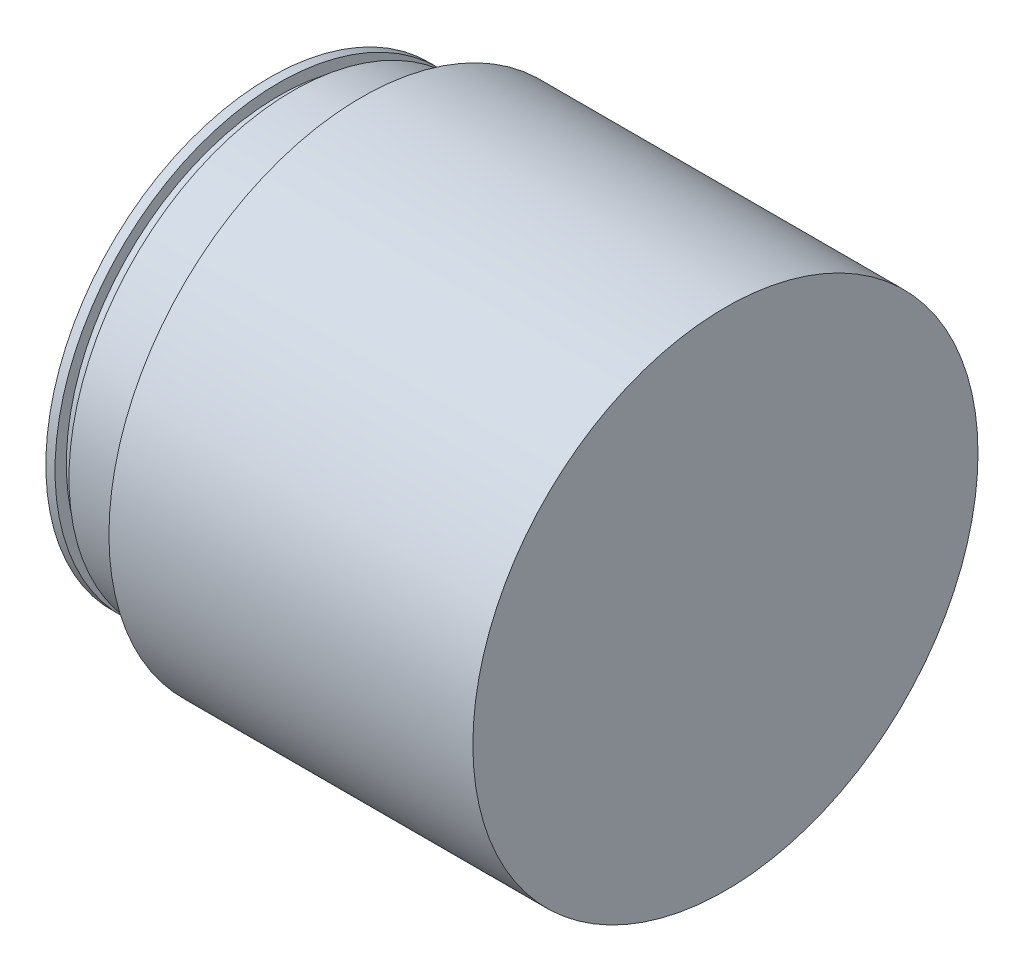
ISO-10303-21;
HEADER;
FILE_DESCRIPTION(('STEP AP214'),'2;1');
FILE_NAME('part.step','',(''),(''),'','','');
FILE_SCHEMA(('AUTOMOTIVE_DESIGN { 1 0 10303 214 1 1 1 1 }'));
ENDSEC;
DATA;
#1=APPLICATION_CONTEXT('core data for automotive mechanical design processes');
#2=APPLICATION_PROTOCOL_DEFINITION('international standard','automotive_design',2000,#1);
#3=PRODUCT_CONTEXT('',#1,'mechanical');
#4=PRODUCT('Part','Part','',(#3));
#5=PRODUCT_RELATED_PRODUCT_CATEGORY('part','',(#4));
#6=PRODUCT_DEFINITION_FORMATION('','',#4);
#7=PRODUCT_DEFINITION_CONTEXT('part definition',#1,'design');
#8=PRODUCT_DEFINITION('design','',#6,#7);
#9=PRODUCT_DEFINITION_SHAPE('','',#8);
#10=(LENGTH_UNIT() NAMED_UNIT(*) SI_UNIT(.MILLI.,.METRE.));
#11=(NAMED_UNIT(*) PLANE_ANGLE_UNIT() SI_UNIT($,.RADIAN.));
#12=(NAMED_UNIT(*) SI_UNIT($,.STERADIAN.) SOLID_ANGLE_UNIT());
#13=UNCERTAINTY_MEASURE_WITH_UNIT(LENGTH_MEASURE(1.E-05),#10,'distance_accuracy_value','');
#14=(GEOMETRIC_REPRESENTATION_CONTEXT(3) GLOBAL_UNCERTAINTY_ASSIGNED_CONTEXT((#13)) GLOBAL_UNIT_ASSIGNED_CONTEXT((#10,
#11,#12)) REPRESENTATION_CONTEXT('',''));
#15=CARTESIAN_POINT('',(0.,0.,0.));
#16=DIRECTION('',(0.,0.,1.));
#17=DIRECTION('',(1.,0.,0.));
#18=AXIS2_PLACEMENT_3D('',#15,#16,#17);
#19=CARTESIAN_POINT('',(85.471,-30.9499,0.));
#20=DIRECTION('',(-1.,0.,0.));
#21=DIRECTION('',(0.,0.,1.));
#22=AXIS2_PLACEMENT_3D('',#19,#20,#21);
#23=CYLINDRICAL_SURFACE('',#22,34.925);
#24=CARTESIAN_POINT('',(12.7,-30.9499,0.));
#25=DIRECTION('',(1.,0.,0.));
#26=DIRECTION('',(0.,0.,-1.));
#27=AXIS2_PLACEMENT_3D('',#24,#25,#26);
#28=CIRCLE('',#27,34.925);
#29=CARTESIAN_POINT('',(12.7,-30.9499,-34.925));
#30=VERTEX_POINT('',#29);
#31=EDGE_CURVE('E73',#30,#30,#28,.T.);
#32=ORIENTED_EDGE('',*,*,#31,.T.);
#33=EDGE_LOOP('',(#32));
#34=FACE_BOUND('',#33,.T.);
#35=CARTESIAN_POINT('',(63.02502,-30.9499,0.));
#36=DIRECTION('',(1.,0.,0.));
#37=DIRECTION('',(0.,0.,-1.));
#38=AXIS2_PLACEMENT_3D('',#35,#36,#37);
#39=CIRCLE('',#38,34.925);
#40=CARTESIAN_POINT('',(63.02502,-30.9499,-34.925));
#41=VERTEX_POINT('',#40);
#42=EDGE_CURVE('E70',#41,#41,#39,.F.);
#43=ORIENTED_EDGE('',*,*,#42,.T.);
#44=EDGE_LOOP('',(#43));
#45=FACE_BOUND('',#44,.T.);
#46=ADVANCED_FACE('F53',(#34,#45),#23,.T.);
#47=CARTESIAN_POINT('',(11.9645218927644,-30.9499,0.));
#48=DIRECTION('',(1.,0.,0.));
#49=DIRECTION('',(0.,0.,-1.));
#50=AXIS2_PLACEMENT_3D('',#47,#48,#49);
#51=CYLINDRICAL_SURFACE('',#50,30.9499);
#52=CARTESIAN_POINT('',(0.,-30.9499,0.));
#53=DIRECTION('',(1.,0.,0.));
#54=DIRECTION('',(0.,0.,-1.));
#55=AXIS2_PLACEMENT_3D('',#52,#53,#54);
#56=CIRCLE('',#55,30.9499);
#57=CARTESIAN_POINT('',(0.,-30.9499,-30.9499));
#58=VERTEX_POINT('',#57);
#59=EDGE_CURVE('E76',#58,#58,#56,.T.);
#60=ORIENTED_EDGE('',*,*,#59,.T.);
#61=EDGE_LOOP('',(#60));
#62=FACE_BOUND('',#61,.T.);
#63=CARTESIAN_POINT('',(1.27,-30.9499,0.));
#64=DIRECTION('',(1.,0.,0.));
#65=DIRECTION('',(0.,0.,-1.));
#66=AXIS2_PLACEMENT_3D('',#63,#64,#65);
#67=CIRCLE('',#66,30.9499);
#68=CARTESIAN_POINT('',(1.27,-30.9499,-30.9499));
#69=VERTEX_POINT('',#68);
#70=EDGE_CURVE('E57',#69,#69,#67,.T.);
#71=ORIENTED_EDGE('',*,*,#70,.F.);
#72=EDGE_LOOP('',(#71));
#73=FACE_BOUND('',#72,.T.);
#74=ADVANCED_FACE('F55',(#62,#73),#51,.T.);
#75=CARTESIAN_POINT('',(1.27,0.,0.));
#76=DIRECTION('',(1.,0.,0.));
#77=DIRECTION('',(0.,0.,-1.));
#78=AXIS2_PLACEMENT_3D('',#75,#76,#77);
#79=PLANE('',#78);
#80=ORIENTED_EDGE('',*,*,#70,.T.);
#81=EDGE_LOOP('',(#80));
#82=FACE_BOUND('',#81,.T.);
#83=CARTESIAN_POINT('',(1.27,-30.9499,0.));
#84=DIRECTION('',(1.,0.,0.));
#85=DIRECTION('',(0.,0.,-1.));
#86=AXIS2_PLACEMENT_3D('',#83,#84,#85);
#87=CIRCLE('',#86,29.3878);
#88=CARTESIAN_POINT('',(1.27,-30.9499,-29.3878));
#89=VERTEX_POINT('',#88);
#90=EDGE_CURVE('E65',#89,#89,#87,.T.);
#91=ORIENTED_EDGE('',*,*,#90,.F.);
#92=EDGE_LOOP('',(#91));
#93=FACE_BOUND('',#92,.T.);
#94=ADVANCED_FACE('F93',(#82,#93),#79,.T.);
#95=CARTESIAN_POINT('',(11.9645218927644,-30.9499,0.));
#96=DIRECTION('',(1.,0.,0.));
#97=DIRECTION('',(0.,0.,-1.));
#98=AXIS2_PLACEMENT_3D('',#95,#96,#97);
#99=CYLINDRICAL_SURFACE('',#98,29.3878);
#100=ORIENTED_EDGE('',*,*,#90,.T.);
#101=EDGE_LOOP('',(#100));
#102=FACE_BOUND('',#101,.T.);
#103=CARTESIAN_POINT('',(3.2004,-30.9499,0.));
#104=DIRECTION('',(1.,0.,0.));
#105=DIRECTION('',(0.,0.,-1.));
#106=AXIS2_PLACEMENT_3D('',#103,#104,#105);
#107=CIRCLE('',#106,29.3878);
#108=CARTESIAN_POINT('',(3.2004,-30.9499,-29.3878));
#109=VERTEX_POINT('',#108);
#110=EDGE_CURVE('E85',#109,#109,#107,.T.);
#111=ORIENTED_EDGE('',*,*,#110,.F.);
#112=EDGE_LOOP('',(#111));
#113=FACE_BOUND('',#112,.T.);
#114=ADVANCED_FACE('F90',(#102,#113),#99,.T.);
#115=CARTESIAN_POINT('',(3.2004,0.,0.));
#116=DIRECTION('',(-1.,0.,0.));
#117=DIRECTION('',(0.,0.,1.));
#118=AXIS2_PLACEMENT_3D('',#115,#116,#117);
#119=PLANE('',#118);
#120=ORIENTED_EDGE('',*,*,#110,.T.);
#121=EDGE_LOOP('',(#120));
#122=FACE_BOUND('',#121,.T.);
#123=CARTESIAN_POINT('',(3.2004,-30.9499,0.));
#124=DIRECTION('',(1.,0.,0.));
#125=DIRECTION('',(0.,0.,-1.));
#126=AXIS2_PLACEMENT_3D('',#123,#124,#125);
#127=CIRCLE('',#126,30.9499);
#128=CARTESIAN_POINT('',(3.2004,-30.9499,-30.9499));
#129=VERTEX_POINT('',#128);
#130=EDGE_CURVE('E82',#129,#129,#127,.T.);
#131=ORIENTED_EDGE('',*,*,#130,.F.);
#132=EDGE_LOOP('',(#131));
#133=FACE_BOUND('',#132,.T.);
#134=ADVANCED_FACE('F100',(#122,#133),#119,.T.);
#135=CARTESIAN_POINT('',(11.9645218927644,-30.9499,0.));
#136=DIRECTION('',(1.,0.,0.));
#137=DIRECTION('',(0.,0.,-1.));
#138=AXIS2_PLACEMENT_3D('',#135,#136,#137);
#139=CYLINDRICAL_SURFACE('',#138,30.9499);
#140=ORIENTED_EDGE('',*,*,#130,.T.);
#141=EDGE_LOOP('',(#140));
#142=FACE_BOUND('',#141,.T.);
#143=CARTESIAN_POINT('',(12.7,-30.9499,0.));
#144=DIRECTION('',(1.,0.,0.));
#145=DIRECTION('',(0.,0.,-1.));
#146=AXIS2_PLACEMENT_3D('',#143,#144,#145);
#147=CIRCLE('',#146,30.9499);
#148=CARTESIAN_POINT('',(12.7,-30.9499,-30.9499));
#149=VERTEX_POINT('',#148);
#150=EDGE_CURVE('E79',#149,#149,#147,.T.);
#151=ORIENTED_EDGE('',*,*,#150,.F.);
#152=EDGE_LOOP('',(#151));
#153=FACE_BOUND('',#152,.T.);
#154=ADVANCED_FACE('F117',(#142,#153),#139,.T.);
#155=CARTESIAN_POINT('',(0.,0.,0.));
#156=DIRECTION('',(-1.,0.,0.));
#157=DIRECTION('',(0.,0.,1.));
#158=AXIS2_PLACEMENT_3D('',#155,#156,#157);
#159=PLANE('',#158);
#160=CARTESIAN_POINT('',(0.,-30.9499,0.));
#161=DIRECTION('',(-1.,0.,0.));
#162=DIRECTION('',(0.,-1.,0.));
#163=AXIS2_PLACEMENT_3D('',#160,#161,#162);
#164=CIRCLE('',#163,22.86);
#165=CARTESIAN_POINT('',(0.,-53.8099,0.));
#166=VERTEX_POINT('',#165);
#167=EDGE_CURVE('E13',#166,#166,#164,.T.);
#168=ORIENTED_EDGE('',*,*,#167,.F.);
#169=EDGE_LOOP('',(#168));
#170=FACE_BOUND('',#169,.T.);
#171=ORIENTED_EDGE('',*,*,#59,.F.);
#172=EDGE_LOOP('',(#171));
#173=FACE_BOUND('',#172,.T.);
#174=ADVANCED_FACE('F115',(#170,#173),#159,.T.);
#175=CARTESIAN_POINT('',(12.7,-30.9499,0.));
#176=DIRECTION('',(1.,0.,0.));
#177=DIRECTION('',(0.,0.,-1.));
#178=AXIS2_PLACEMENT_3D('',#175,#176,#177);
#179=PLANE('',#178);
#180=ORIENTED_EDGE('',*,*,#150,.T.);
#181=EDGE_LOOP('',(#180));
#182=FACE_BOUND('',#181,.T.);
#183=ORIENTED_EDGE('',*,*,#31,.F.);
#184=EDGE_LOOP('',(#183));
#185=FACE_BOUND('',#184,.T.);
#186=ADVANCED_FACE('F113',(#182,#185),#179,.F.);
#187=CARTESIAN_POINT('',(63.02502,-36.0299000867761,-8.79881805234969));
#188=DIRECTION('',(1.,0.,0.));
#189=DIRECTION('',(0.,0.,-1.));
#190=AXIS2_PLACEMENT_3D('',#187,#188,#189);
#191=PLANE('',#190);
#192=ORIENTED_EDGE('',*,*,#42,.F.);
#193=EDGE_LOOP('',(#192));
#194=FACE_BOUND('',#193,.T.);
#195=ADVANCED_FACE('F133',(#194),#191,.T.);
#196=CARTESIAN_POINT('',(-1.01599999999999,-30.9499,0.));
#197=DIRECTION('',(1.,0.,0.));
#198=DIRECTION('',(0.,1.,0.));
#199=AXIS2_PLACEMENT_3D('',#196,#197,#198);
#200=CYLINDRICAL_SURFACE('',#199,22.86);
#201=CARTESIAN_POINT('',(-1.01599999999999,-30.9499,0.));
#202=DIRECTION('',(-1.,0.,0.));
#203=DIRECTION('',(0.,-1.,0.));
#204=AXIS2_PLACEMENT_3D('',#201,#202,#203);
#205=CIRCLE('',#204,22.86);
#206=CARTESIAN_POINT('',(-1.01599999999998,-53.8099,0.));
#207=VERTEX_POINT('',#206);
#208=EDGE_CURVE('E68',#207,#207,#205,.T.);
#209=ORIENTED_EDGE('',*,*,#208,.F.);
#210=EDGE_LOOP('',(#209));
#211=FACE_BOUND('',#210,.T.);
#212=ORIENTED_EDGE('',*,*,#167,.T.);
#213=EDGE_LOOP('',(#212));
#214=FACE_BOUND('',#213,.T.);
#215=ADVANCED_FACE('F138',(#211,#214),#200,.T.);
#216=CARTESIAN_POINT('',(-1.01599999999999,-30.9499,0.));
#217=DIRECTION('',(-1.,0.,0.));
#218=DIRECTION('',(0.,-1.,0.));
#219=AXIS2_PLACEMENT_3D('',#216,#217,#218);
#220=PLANE('',#219);
#221=CARTESIAN_POINT('',(-1.01599999999999,-30.9499,0.));
#222=DIRECTION('',(-1.,0.,0.));
#223=DIRECTION('',(0.,-1.,0.));
#224=AXIS2_PLACEMENT_3D('',#221,#222,#223);
#225=CIRCLE('',#224,4.1021);
#226=CARTESIAN_POINT('',(-1.01599999999999,-30.9499,-4.1021));
#227=VERTEX_POINT('',#226);
#228=EDGE_CURVE('E206',#227,#227,#225,.F.);
#229=ORIENTED_EDGE('',*,*,#228,.T.);
#230=EDGE_LOOP('',(#229));
#231=FACE_BOUND('',#230,.T.);
#232=CARTESIAN_POINT('',(-1.01599999999998,-30.9499,-9.525));
#233=DIRECTION('',(1.,0.,0.));
#234=DIRECTION('',(0.,0.,-1.));
#235=AXIS2_PLACEMENT_3D('',#232,#233,#234);
#236=CIRCLE('',#235,3.175);
#237=CARTESIAN_POINT('',(-1.01599999999998,-30.9499,-12.7));
#238=VERTEX_POINT('',#237);
#239=EDGE_CURVE('E209',#238,#238,#236,.T.);
#240=ORIENTED_EDGE('',*,*,#239,.T.);
#241=EDGE_LOOP('',(#240));
#242=FACE_BOUND('',#241,.T.);
#243=CARTESIAN_POINT('',(-1.01599999999998,-40.4749,0.));
#244=DIRECTION('',(1.,0.,0.));
#245=DIRECTION('',(0.,0.,-1.));
#246=AXIS2_PLACEMENT_3D('',#243,#244,#245);
#247=CIRCLE('',#246,3.175);
#248=CARTESIAN_POINT('',(-1.01599999999998,-40.4749,-3.175));
#249=VERTEX_POINT('',#248);
#250=EDGE_CURVE('E212',#249,#249,#247,.T.);
#251=ORIENTED_EDGE('',*,*,#250,.T.);
#252=EDGE_LOOP('',(#251));
#253=FACE_BOUND('',#252,.T.);
#254=CARTESIAN_POINT('',(-1.01599999999998,-30.9499,9.525));
#255=DIRECTION('',(1.,0.,0.));
#256=DIRECTION('',(0.,0.,-1.));
#257=AXIS2_PLACEMENT_3D('',#254,#255,#256);
#258=CIRCLE('',#257,3.175);
#259=CARTESIAN_POINT('',(-1.01599999999998,-30.9499,6.35));
#260=VERTEX_POINT('',#259);
#261=EDGE_CURVE('E215',#260,#260,#258,.T.);
#262=ORIENTED_EDGE('',*,*,#261,.T.);
#263=EDGE_LOOP('',(#262));
#264=FACE_BOUND('',#263,.T.);
#265=CARTESIAN_POINT('',(-1.01599999999998,-21.4249,0.));
#266=DIRECTION('',(1.,0.,0.));
#267=DIRECTION('',(0.,0.,-1.));
#268=AXIS2_PLACEMENT_3D('',#265,#266,#267);
#269=CIRCLE('',#268,3.175);
#270=CARTESIAN_POINT('',(-1.01599999999998,-21.4249,-3.175));
#271=VERTEX_POINT('',#270);
#272=EDGE_CURVE('E217',#271,#271,#269,.T.);
#273=ORIENTED_EDGE('',*,*,#272,.T.);
#274=EDGE_LOOP('',(#273));
#275=FACE_BOUND('',#274,.T.);
#276=ORIENTED_EDGE('',*,*,#208,.T.);
#277=EDGE_LOOP('',(#276));
#278=FACE_BOUND('',#277,.T.);
#279=ADVANCED_FACE('F143',(#231,#242,#253,#264,#275,#278),#220,.T.);
#280=CARTESIAN_POINT('',(12.7,-21.4249,0.));
#281=DIRECTION('',(1.,0.,0.));
#282=DIRECTION('',(0.,0.,-1.));
#283=AXIS2_PLACEMENT_3D('',#280,#281,#282);
#284=CYLINDRICAL_SURFACE('',#283,3.175);
#285=ORIENTED_EDGE('',*,*,#272,.F.);
#286=EDGE_LOOP('',(#285));
#287=FACE_BOUND('',#286,.T.);
#288=CARTESIAN_POINT('',(12.7,-21.4249,0.));
#289=DIRECTION('',(1.,0.,0.));
#290=DIRECTION('',(0.,0.,-1.));
#291=AXIS2_PLACEMENT_3D('',#288,#289,#290);
#292=CIRCLE('',#291,3.175);
#293=CARTESIAN_POINT('',(12.7,-21.4249,-3.175));
#294=VERTEX_POINT('',#293);
#295=EDGE_CURVE('E204',#294,#294,#292,.F.);
#296=ORIENTED_EDGE('',*,*,#295,.F.);
#297=EDGE_LOOP('',(#296));
#298=FACE_BOUND('',#297,.T.);
#299=ADVANCED_FACE('F150',(#287,#298),#284,.F.);
#300=CARTESIAN_POINT('',(12.7,-30.9499,9.525));
#301=DIRECTION('',(1.,0.,0.));
#302=DIRECTION('',(0.,0.,-1.));
#303=AXIS2_PLACEMENT_3D('',#300,#301,#302);
#304=CYLINDRICAL_SURFACE('',#303,3.175);
#305=ORIENTED_EDGE('',*,*,#261,.F.);
#306=EDGE_LOOP('',(#305));
#307=FACE_BOUND('',#306,.T.);
#308=CARTESIAN_POINT('',(12.7,-30.9499,9.525));
#309=DIRECTION('',(1.,0.,0.));
#310=DIRECTION('',(0.,0.,-1.));
#311=AXIS2_PLACEMENT_3D('',#308,#309,#310);
#312=CIRCLE('',#311,3.175);
#313=CARTESIAN_POINT('',(12.7,-30.9499,6.35));
#314=VERTEX_POINT('',#313);
#315=EDGE_CURVE('E201',#314,#314,#312,.F.);
#316=ORIENTED_EDGE('',*,*,#315,.F.);
#317=EDGE_LOOP('',(#316));
#318=FACE_BOUND('',#317,.T.);
#319=ADVANCED_FACE('F154',(#307,#318),#304,.F.);
#320=CARTESIAN_POINT('',(12.7,-40.4749,0.));
#321=DIRECTION('',(1.,0.,0.));
#322=DIRECTION('',(0.,0.,-1.));
#323=AXIS2_PLACEMENT_3D('',#320,#321,#322);
#324=CYLINDRICAL_SURFACE('',#323,3.175);
#325=ORIENTED_EDGE('',*,*,#250,.F.);
#326=EDGE_LOOP('',(#325));
#327=FACE_BOUND('',#326,.T.);
#328=CARTESIAN_POINT('',(12.7,-40.4749,0.));
#329=DIRECTION('',(1.,0.,0.));
#330=DIRECTION('',(0.,0.,-1.));
#331=AXIS2_PLACEMENT_3D('',#328,#329,#330);
#332=CIRCLE('',#331,3.175);
#333=CARTESIAN_POINT('',(12.7,-40.4749,-3.175));
#334=VERTEX_POINT('',#333);
#335=EDGE_CURVE('E196',#334,#334,#332,.F.);
#336=ORIENTED_EDGE('',*,*,#335,.F.);
#337=EDGE_LOOP('',(#336));
#338=FACE_BOUND('',#337,.T.);
#339=ADVANCED_FACE('F158',(#327,#338),#324,.F.);
#340=CARTESIAN_POINT('',(12.7,-30.9499,-9.525));
#341=DIRECTION('',(1.,0.,0.));
#342=DIRECTION('',(0.,0.,-1.));
#343=AXIS2_PLACEMENT_3D('',#340,#341,#342);
#344=CYLINDRICAL_SURFACE('',#343,3.175);
#345=ORIENTED_EDGE('',*,*,#239,.F.);
#346=EDGE_LOOP('',(#345));
#347=FACE_BOUND('',#346,.T.);
#348=CARTESIAN_POINT('',(12.7,-30.9499,-9.525));
#349=DIRECTION('',(1.,0.,0.));
#350=DIRECTION('',(0.,0.,-1.));
#351=AXIS2_PLACEMENT_3D('',#348,#349,#350);
#352=CIRCLE('',#351,3.175);
#353=CARTESIAN_POINT('',(12.7,-30.9499,-12.7));
#354=VERTEX_POINT('',#353);
#355=EDGE_CURVE('E193',#354,#354,#352,.F.);
#356=ORIENTED_EDGE('',*,*,#355,.F.);
#357=EDGE_LOOP('',(#356));
#358=FACE_BOUND('',#357,.T.);
#359=ADVANCED_FACE('F162',(#347,#358),#344,.F.);
#360=CARTESIAN_POINT('',(-12.6184909084213,-30.9499,0.));
#361=DIRECTION('',(1.,0.,0.));
#362=DIRECTION('',(0.,0.,-1.));
#363=AXIS2_PLACEMENT_3D('',#360,#361,#362);
#364=CYLINDRICAL_SURFACE('',#363,4.1021);
#365=CARTESIAN_POINT('',(12.7,-30.9499,0.));
#366=DIRECTION('',(1.,0.,0.));
#367=DIRECTION('',(0.,0.,-1.));
#368=AXIS2_PLACEMENT_3D('',#365,#366,#367);
#369=CIRCLE('',#368,4.1021);
#370=CARTESIAN_POINT('',(12.7,-30.9499,-4.1021));
#371=VERTEX_POINT('',#370);
#372=EDGE_CURVE('E192',#371,#371,#369,.F.);
#373=CARTESIAN_POINT('',(12.7,-30.9499,-4.1021));
#374=CARTESIAN_POINT('',(12.557125,-30.9499,-4.1021));
#375=CARTESIAN_POINT('',(12.41425,-30.9499,-4.1021));
#376=CARTESIAN_POINT('',(12.1285,-30.9499,-4.1021));
#377=CARTESIAN_POINT('',(11.985625,-30.9499,-4.1021));
#378=CARTESIAN_POINT('',(11.699875,-30.9499,-4.1021));
#379=CARTESIAN_POINT('',(11.557,-30.9499,-4.1021));
#380=CARTESIAN_POINT('',(11.27125,-30.9499,-4.1021));
#381=CARTESIAN_POINT('',(11.128375,-30.9499,-4.1021));
#382=CARTESIAN_POINT('',(10.842625,-30.9499,-4.1021));
#383=CARTESIAN_POINT('',(10.69975,-30.9499,-4.1021));
#384=CARTESIAN_POINT('',(10.414,-30.9499,-4.1021));
#385=CARTESIAN_POINT('',(10.271125,-30.9499,-4.1021));
#386=CARTESIAN_POINT('',(9.985375,-30.9499,-4.1021));
#387=CARTESIAN_POINT('',(9.8425,-30.9499,-4.1021));
#388=CARTESIAN_POINT('',(9.55675,-30.9499,-4.1021));
#389=CARTESIAN_POINT('',(9.413875,-30.9499,-4.1021));
#390=CARTESIAN_POINT('',(9.128125,-30.9499,-4.1021));
#391=CARTESIAN_POINT('',(8.98525,-30.9499,-4.1021));
#392=CARTESIAN_POINT('',(8.6995,-30.9499,-4.1021));
#393=CARTESIAN_POINT('',(8.556625,-30.9499,-4.1021));
#394=CARTESIAN_POINT('',(8.270875,-30.9499,-4.1021));
#395=CARTESIAN_POINT('',(8.128,-30.9499,-4.1021));
#396=CARTESIAN_POINT('',(7.84225,-30.9499,-4.1021));
#397=CARTESIAN_POINT('',(7.699375,-30.9499,-4.1021));
#398=CARTESIAN_POINT('',(7.413625,-30.9499,-4.1021));
#399=CARTESIAN_POINT('',(7.27075,-30.9499,-4.1021));
#400=CARTESIAN_POINT('',(6.985,-30.9499,-4.1021));
#401=CARTESIAN_POINT('',(6.842125,-30.9499,-4.1021));
#402=CARTESIAN_POINT('',(6.556375,-30.9499,-4.1021));
#403=CARTESIAN_POINT('',(6.41350000000001,-30.9499,-4.1021));
#404=CARTESIAN_POINT('',(6.12775000000001,-30.9499,-4.1021));
#405=CARTESIAN_POINT('',(5.984875,-30.9499,-4.1021));
#406=CARTESIAN_POINT('',(5.699125,-30.9499,-4.1021));
#407=CARTESIAN_POINT('',(5.55625,-30.9499,-4.1021));
#408=CARTESIAN_POINT('',(5.2705,-30.9499,-4.1021));
#409=CARTESIAN_POINT('',(5.127625,-30.9499,-4.1021));
#410=CARTESIAN_POINT('',(4.841875,-30.9499,-4.1021));
#411=CARTESIAN_POINT('',(4.699,-30.9499,-4.1021));
#412=CARTESIAN_POINT('',(4.41325,-30.9499,-4.1021));
#413=CARTESIAN_POINT('',(4.270375,-30.9499,-4.1021));
#414=CARTESIAN_POINT('',(3.984625,-30.9499,-4.1021));
#415=CARTESIAN_POINT('',(3.84175,-30.9499,-4.1021));
#416=CARTESIAN_POINT('',(3.556,-30.9499,-4.1021));
#417=CARTESIAN_POINT('',(3.41312500000001,-30.9499,-4.1021));
#418=CARTESIAN_POINT('',(3.12737500000001,-30.9499,-4.1021));
#419=CARTESIAN_POINT('',(2.98450000000001,-30.9499,-4.1021));
#420=CARTESIAN_POINT('',(2.69875000000001,-30.9499,-4.1021));
#421=CARTESIAN_POINT('',(2.55587500000001,-30.9499,-4.1021));
#422=CARTESIAN_POINT('',(2.27012500000001,-30.9499,-4.1021));
#423=CARTESIAN_POINT('',(2.12725000000001,-30.9499,-4.1021));
#424=CARTESIAN_POINT('',(1.84150000000001,-30.9499,-4.1021));
#425=CARTESIAN_POINT('',(1.69862500000001,-30.9499,-4.1021));
#426=CARTESIAN_POINT('',(1.41287500000001,-30.9499,-4.1021));
#427=CARTESIAN_POINT('',(1.27000000000001,-30.9499,-4.1021));
#428=CARTESIAN_POINT('',(0.984250000000008,-30.9499,-4.1021));
#429=CARTESIAN_POINT('',(0.841375000000008,-30.9499,-4.1021));
#430=CARTESIAN_POINT('',(0.555625000000008,-30.9499,-4.1021));
#431=CARTESIAN_POINT('',(0.412750000000008,-30.9499,-4.1021));
#432=CARTESIAN_POINT('',(0.127000000000008,-30.9499,-4.1021));
#433=CARTESIAN_POINT('',(-0.0158749999999911,-30.9499,-4.1021));
#434=CARTESIAN_POINT('',(-0.30162499999999,-30.9499,-4.1021));
#435=CARTESIAN_POINT('',(-0.444499999999991,-30.9499,-4.1021));
#436=CARTESIAN_POINT('',(-0.730249999999991,-30.9499,-4.1021));
#437=CARTESIAN_POINT('',(-0.873124999999991,-30.9499,-4.1021));
#438=CARTESIAN_POINT('',(-1.01599999999999,-30.9499,-4.1021));
#439=B_SPLINE_CURVE_WITH_KNOTS('',3,(#373,#374,#375,#376,#377,#378,#379,#380,#381,#382,#383,
#384,#385,#386,#387,#388,#389,#390,#391,#392,#393,#394,#395,#396,#397,#398,#399,#400,#401,#402,
#403,#404,#405,#406,#407,#408,#409,#410,#411,#412,#413,#414,#415,#416,#417,#418,#419,#420,#421,
#422,#423,#424,#425,#426,#427,#428,#429,#430,#431,#432,#433,#434,#435,#436,#437,#438),
.UNSPECIFIED.,.F.,.F.,(4,2,2,2,2,2,2,2,2,2,2,2,2,2,2,2,2,2,2,2,2,2,2,2,2,2,2,2,2,2,2,2,4),(0.,
0.428624999999998,0.85725,1.285875,1.7145,2.143125,2.57175,3.000375,3.429,3.857625,4.28625,
4.714875,5.1435,5.572125,6.00075,6.42937499999999,6.858,7.286625,7.71525,8.14387499999999,
8.5725,9.00112499999999,9.42974999999999,9.85837499999999,10.287,10.715625,11.14425,11.572875,
12.0015,12.430125,12.85875,13.287375,13.716),.UNSPECIFIED.);
#440=EDGE_CURVE('BSEAM166',#371,#227,#439,.T.);
#441=ORIENTED_EDGE('',*,*,#372,.F.);
#442=ORIENTED_EDGE('',*,*,#228,.F.);
#443=ORIENTED_EDGE('',*,*,#440,.T.);
#444=ORIENTED_EDGE('',*,*,#440,.F.);
#445=EDGE_LOOP('',(#441,#443,#442,#444));
#446=FACE_BOUND('',#445,.T.);
#447=ADVANCED_FACE('F166',(#446),#364,.F.);
#448=CARTESIAN_POINT('',(12.7,-30.9499,0.));
#449=DIRECTION('',(1.,0.,0.));
#450=DIRECTION('',(0.,0.,-1.));
#451=AXIS2_PLACEMENT_3D('',#448,#449,#450);
#452=PLANE('',#451);
#453=ORIENTED_EDGE('',*,*,#372,.T.);
#454=EDGE_LOOP('',(#453));
#455=FACE_BOUND('',#454,.T.);
#456=ADVANCED_FACE('F170',(#455),#452,.F.);
#457=ORIENTED_EDGE('',*,*,#355,.T.);
#458=EDGE_LOOP('',(#457));
#459=FACE_BOUND('',#458,.T.);
#460=ADVANCED_FACE('F183',(#459),#452,.F.);
#461=ORIENTED_EDGE('',*,*,#335,.T.);
#462=EDGE_LOOP('',(#461));
#463=FACE_BOUND('',#462,.T.);
#464=ADVANCED_FACE('F179',(#463),#452,.F.);
#465=ORIENTED_EDGE('',*,*,#315,.T.);
#466=EDGE_LOOP('',(#465));
#467=FACE_BOUND('',#466,.T.);
#468=ADVANCED_FACE('F174',(#467),#452,.F.);
#469=ORIENTED_EDGE('',*,*,#295,.T.);
#470=EDGE_LOOP('',(#469));
#471=FACE_BOUND('',#470,.T.);
#472=ADVANCED_FACE('F172',(#471),#452,.F.);
#473=CLOSED_SHELL('',(#46,#74,#94,#114,#134,#154,#174,#186,#195,#215,#279,#299,#319,#339,#359,
#447,#456,#460,#464,#468,#472));
#474=MANIFOLD_SOLID_BREP('B2',#473);
#475=ADVANCED_BREP_SHAPE_REPRESENTATION('',(#18,#474),#14);
#476=SHAPE_DEFINITION_REPRESENTATION(#9,#475);
ENDSEC;
END-ISO-10303-21;
